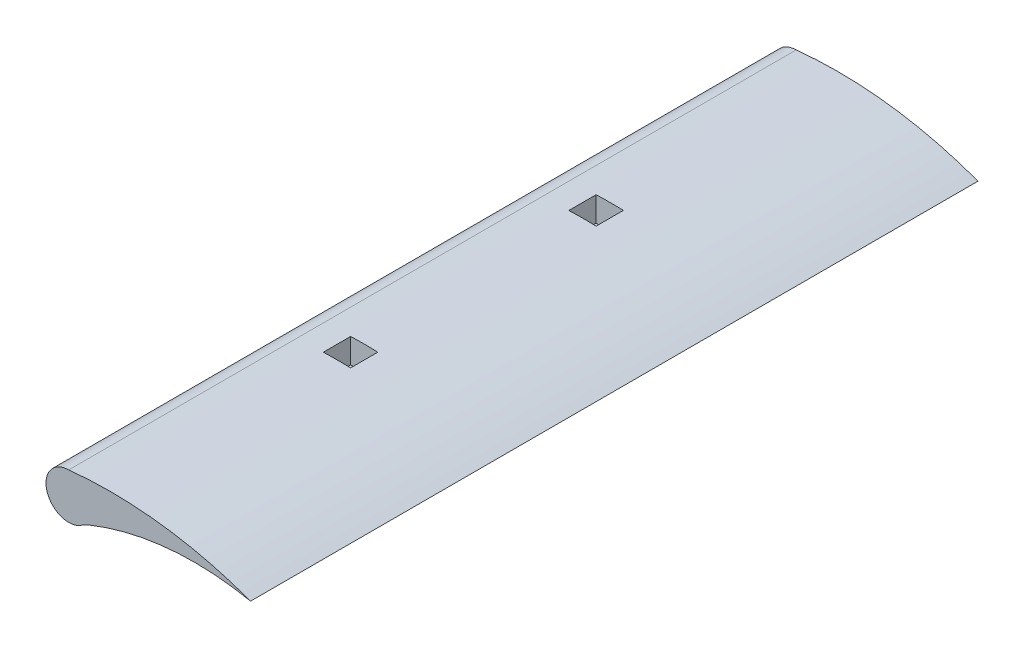
ISO-10303-21;
HEADER;
FILE_DESCRIPTION(('STEP AP214'),'2;1');
FILE_NAME('part.step','',(''),(''),'','','');
FILE_SCHEMA(('AUTOMOTIVE_DESIGN { 1 0 10303 214 1 1 1 1 }'));
ENDSEC;
DATA;
#1=APPLICATION_CONTEXT('core data for automotive mechanical design processes');
#2=APPLICATION_PROTOCOL_DEFINITION('international standard','automotive_design',2000,#1);
#3=PRODUCT_CONTEXT('',#1,'mechanical');
#4=PRODUCT('Part','Part','',(#3));
#5=PRODUCT_RELATED_PRODUCT_CATEGORY('part','',(#4));
#6=PRODUCT_DEFINITION_FORMATION('','',#4);
#7=PRODUCT_DEFINITION_CONTEXT('part definition',#1,'design');
#8=PRODUCT_DEFINITION('design','',#6,#7);
#9=PRODUCT_DEFINITION_SHAPE('','',#8);
#10=(LENGTH_UNIT() NAMED_UNIT(*) SI_UNIT(.MILLI.,.METRE.));
#11=(NAMED_UNIT(*) PLANE_ANGLE_UNIT() SI_UNIT($,.RADIAN.));
#12=(NAMED_UNIT(*) SI_UNIT($,.STERADIAN.) SOLID_ANGLE_UNIT());
#13=UNCERTAINTY_MEASURE_WITH_UNIT(LENGTH_MEASURE(1.E-05),#10,'distance_accuracy_value','');
#14=(GEOMETRIC_REPRESENTATION_CONTEXT(3) GLOBAL_UNCERTAINTY_ASSIGNED_CONTEXT((#13)) GLOBAL_UNIT_ASSIGNED_CONTEXT((#10,
#11,#12)) REPRESENTATION_CONTEXT('',''));
#15=CARTESIAN_POINT('',(0.,0.,0.));
#16=DIRECTION('',(0.,0.,1.));
#17=DIRECTION('',(1.,0.,0.));
#18=AXIS2_PLACEMENT_3D('',#15,#16,#17);
#19=CARTESIAN_POINT('',(4.60826121824582,-41.8839102540334,40.));
#20=DIRECTION('',(0.,0.,-1.));
#21=DIRECTION('',(-1.,0.,0.));
#22=AXIS2_PLACEMENT_3D('',#19,#20,#21);
#23=CYLINDRICAL_SURFACE('',#22,44.6225006122884);
#24=CARTESIAN_POINT('',(4.60826121824582,-41.8839102540334,-40.));
#25=DIRECTION('',(0.,0.,1.));
#26=DIRECTION('',(-1.,0.,0.));
#27=AXIS2_PLACEMENT_3D('',#24,#25,#26);
#28=CIRCLE('',#27,44.6225006122884);
#29=CARTESIAN_POINT('',(20.,0.,-40.));
#30=VERTEX_POINT('',#29);
#31=CARTESIAN_POINT('',(0.,2.5,-40.));
#32=VERTEX_POINT('',#31);
#33=EDGE_CURVE('E203',#30,#32,#28,.T.);
#34=ORIENTED_EDGE('',*,*,#33,.T.);
#35=DIRECTION('',(0.,0.,-1.));
#36=VECTOR('',#35,1.);
#37=CARTESIAN_POINT('',(0.,2.5,40.));
#38=LINE('',#37,#36);
#39=CARTESIAN_POINT('',(0.,2.5,40.));
#40=VERTEX_POINT('',#39);
#41=EDGE_CURVE('E210',#40,#32,#38,.T.);
#42=ORIENTED_EDGE('',*,*,#41,.F.);
#43=CARTESIAN_POINT('',(4.60826121824582,-41.8839102540334,40.));
#44=DIRECTION('',(0.,0.,1.));
#45=DIRECTION('',(-1.,0.,0.));
#46=AXIS2_PLACEMENT_3D('',#43,#44,#45);
#47=CIRCLE('',#46,44.6225006122884);
#48=CARTESIAN_POINT('',(20.,0.,40.));
#49=VERTEX_POINT('',#48);
#50=EDGE_CURVE('E89',#49,#40,#47,.T.);
#51=ORIENTED_EDGE('',*,*,#50,.F.);
#52=DIRECTION('',(0.,0.,-1.));
#53=VECTOR('',#52,1.);
#54=CARTESIAN_POINT('',(20.,0.,40.));
#55=LINE('',#54,#53);
#56=EDGE_CURVE('E212',#49,#30,#55,.T.);
#57=ORIENTED_EDGE('',*,*,#56,.T.);
#58=EDGE_LOOP('',(#34,#42,#51,#57));
#59=FACE_BOUND('',#58,.T.);
#60=CARTESIAN_POINT('',(4.60826121824582,-41.8839102540334,-15.));
#61=DIRECTION('',(0.,0.,1.));
#62=DIRECTION('',(1.,0.,0.));
#63=AXIS2_PLACEMENT_3D('',#60,#61,#62);
#64=CIRCLE('',#63,44.6225006122884);
#65=CARTESIAN_POINT('',(6.,2.71688148845745,-15.));
#66=VERTEX_POINT('',#65);
#67=CARTESIAN_POINT('',(3.,2.70959887843526,-15.));
#68=VERTEX_POINT('',#67);
#69=EDGE_CURVE('E214',#66,#68,#64,.T.);
#70=ORIENTED_EDGE('',*,*,#69,.F.);
#71=DIRECTION('',(0.,0.,-1.));
#72=VECTOR('',#71,1.);
#73=CARTESIAN_POINT('',(6.,2.71688148845745,40.));
#74=LINE('',#73,#72);
#75=CARTESIAN_POINT('',(6.,2.71688148845745,-12.));
#76=VERTEX_POINT('',#75);
#77=EDGE_CURVE('E221',#76,#66,#74,.T.);
#78=ORIENTED_EDGE('',*,*,#77,.F.);
#79=CARTESIAN_POINT('',(4.60826121824582,-41.8839102540334,-12.));
#80=DIRECTION('',(0.,0.,-1.));
#81=DIRECTION('',(-1.,0.,0.));
#82=AXIS2_PLACEMENT_3D('',#79,#80,#81);
#83=CIRCLE('',#82,44.6225006122884);
#84=CARTESIAN_POINT('',(3.,2.70959887843526,-12.));
#85=VERTEX_POINT('',#84);
#86=EDGE_CURVE('E216',#85,#76,#83,.T.);
#87=ORIENTED_EDGE('',*,*,#86,.F.);
#88=DIRECTION('',(0.,0.,-1.));
#89=VECTOR('',#88,1.);
#90=CARTESIAN_POINT('',(3.,2.70959887843526,40.));
#91=LINE('',#90,#89);
#92=EDGE_CURVE('E218',#68,#85,#91,.F.);
#93=ORIENTED_EDGE('',*,*,#92,.F.);
#94=EDGE_LOOP('',(#70,#78,#87,#93));
#95=FACE_BOUND('',#94,.T.);
#96=CARTESIAN_POINT('',(4.60826121824582,-41.8839102540334,15.));
#97=DIRECTION('',(0.,0.,-1.));
#98=DIRECTION('',(-1.,0.,0.));
#99=AXIS2_PLACEMENT_3D('',#96,#97,#98);
#100=CIRCLE('',#99,44.6225006122884);
#101=CARTESIAN_POINT('',(3.,2.70959887843526,15.));
#102=VERTEX_POINT('',#101);
#103=CARTESIAN_POINT('',(6.,2.71688148845745,15.));
#104=VERTEX_POINT('',#103);
#105=EDGE_CURVE('E224',#102,#104,#100,.T.);
#106=ORIENTED_EDGE('',*,*,#105,.F.);
#107=DIRECTION('',(0.,0.,-1.));
#108=VECTOR('',#107,1.);
#109=CARTESIAN_POINT('',(3.,2.70959887843526,40.));
#110=LINE('',#109,#108);
#111=CARTESIAN_POINT('',(3.,2.70959887843526,12.));
#112=VERTEX_POINT('',#111);
#113=EDGE_CURVE('E11',#112,#102,#110,.F.);
#114=ORIENTED_EDGE('',*,*,#113,.F.);
#115=CARTESIAN_POINT('',(4.60826121824582,-41.8839102540334,12.));
#116=DIRECTION('',(0.,0.,1.));
#117=DIRECTION('',(1.,0.,0.));
#118=AXIS2_PLACEMENT_3D('',#115,#116,#117);
#119=CIRCLE('',#118,44.6225006122884);
#120=CARTESIAN_POINT('',(6.,2.71688148845745,12.));
#121=VERTEX_POINT('',#120);
#122=EDGE_CURVE('E226',#121,#112,#119,.T.);
#123=ORIENTED_EDGE('',*,*,#122,.F.);
#124=DIRECTION('',(0.,0.,-1.));
#125=VECTOR('',#124,1.);
#126=CARTESIAN_POINT('',(6.,2.71688148845745,40.));
#127=LINE('',#126,#125);
#128=EDGE_CURVE('E49',#104,#121,#127,.T.);
#129=ORIENTED_EDGE('',*,*,#128,.F.);
#130=EDGE_LOOP('',(#106,#114,#123,#129));
#131=FACE_BOUND('',#130,.T.);
#132=ADVANCED_FACE('F40',(#59,#95,#131),#23,.T.);
#133=CARTESIAN_POINT('',(13.8252073481001,-30.3031623614519,40.));
#134=DIRECTION('',(0.,0.,-1.));
#135=DIRECTION('',(-1.,0.,0.));
#136=AXIS2_PLACEMENT_3D('',#133,#134,#135);
#137=CYLINDRICAL_SURFACE('',#136,30.9258744969075);
#138=CARTESIAN_POINT('',(13.8252073481001,-30.3031623614519,-40.));
#139=DIRECTION('',(0.,0.,-1.));
#140=DIRECTION('',(1.,0.,0.));
#141=AXIS2_PLACEMENT_3D('',#138,#139,#140);
#142=CIRCLE('',#141,30.9258744969075);
#143=CARTESIAN_POINT('',(2.22683424907984,-1.63458278634223,-40.));
#144=VERTEX_POINT('',#143);
#145=EDGE_CURVE('E149',#144,#30,#142,.T.);
#146=ORIENTED_EDGE('',*,*,#145,.T.);
#147=ORIENTED_EDGE('',*,*,#56,.F.);
#148=CARTESIAN_POINT('',(13.8252073481001,-30.3031623614519,40.));
#149=DIRECTION('',(0.,0.,-1.));
#150=DIRECTION('',(1.,0.,0.));
#151=AXIS2_PLACEMENT_3D('',#148,#149,#150);
#152=CIRCLE('',#151,30.9258744969075);
#153=CARTESIAN_POINT('',(2.22683424907984,-1.63458278634223,40.));
#154=VERTEX_POINT('',#153);
#155=EDGE_CURVE('E194',#154,#49,#152,.T.);
#156=ORIENTED_EDGE('',*,*,#155,.F.);
#157=DIRECTION('',(0.,0.,-1.));
#158=VECTOR('',#157,1.);
#159=CARTESIAN_POINT('',(2.22683424907984,-1.63458278634223,40.));
#160=LINE('',#159,#158);
#161=EDGE_CURVE('E200',#154,#144,#160,.T.);
#162=ORIENTED_EDGE('',*,*,#161,.T.);
#163=EDGE_LOOP('',(#146,#147,#156,#162));
#164=FACE_BOUND('',#163,.T.);
#165=ADVANCED_FACE('F42',(#164),#137,.F.);
#166=CARTESIAN_POINT('',(0.,0.,40.));
#167=DIRECTION('',(0.,0.,-1.));
#168=DIRECTION('',(-1.,0.,0.));
#169=AXIS2_PLACEMENT_3D('',#166,#167,#168);
#170=CYLINDRICAL_SURFACE('',#169,2.5);
#171=CARTESIAN_POINT('',(0.,0.,-40.));
#172=DIRECTION('',(0.,0.,1.));
#173=DIRECTION('',(1.,0.,0.));
#174=AXIS2_PLACEMENT_3D('',#171,#172,#173);
#175=CIRCLE('',#174,2.5);
#176=CARTESIAN_POINT('',(1.39058743412579,-2.07756265562593,-40.));
#177=VERTEX_POINT('',#176);
#178=EDGE_CURVE('E75',#32,#177,#175,.T.);
#179=ORIENTED_EDGE('',*,*,#178,.T.);
#180=DIRECTION('',(0.,0.,-1.));
#181=VECTOR('',#180,1.);
#182=CARTESIAN_POINT('',(1.39058743412579,-2.07756265562593,40.));
#183=LINE('',#182,#181);
#184=CARTESIAN_POINT('',(1.39058743412579,-2.07756265562593,40.));
#185=VERTEX_POINT('',#184);
#186=EDGE_CURVE('E208',#185,#177,#183,.T.);
#187=ORIENTED_EDGE('',*,*,#186,.F.);
#188=CARTESIAN_POINT('',(0.,0.,40.));
#189=DIRECTION('',(0.,0.,1.));
#190=DIRECTION('',(1.,0.,0.));
#191=AXIS2_PLACEMENT_3D('',#188,#189,#190);
#192=CIRCLE('',#191,2.5);
#193=EDGE_CURVE('E197',#40,#185,#192,.T.);
#194=ORIENTED_EDGE('',*,*,#193,.F.);
#195=ORIENTED_EDGE('',*,*,#41,.T.);
#196=EDGE_LOOP('',(#179,#187,#194,#195));
#197=FACE_BOUND('',#196,.T.);
#198=ADVANCED_FACE('F246',(#197),#170,.T.);
#199=CARTESIAN_POINT('',(3.95767947195082,-5.91284436496541,40.));
#200=DIRECTION('',(0.,0.,-1.));
#201=DIRECTION('',(-1.,0.,0.));
#202=AXIS2_PLACEMENT_3D('',#199,#200,#201);
#203=CYLINDRICAL_SURFACE('',#202,4.6151215932691);
#204=CARTESIAN_POINT('',(3.95767947195082,-5.91284436496541,-40.));
#205=DIRECTION('',(0.,0.,-1.));
#206=DIRECTION('',(1.,0.,0.));
#207=AXIS2_PLACEMENT_3D('',#204,#205,#206);
#208=CIRCLE('',#207,4.6151215932691);
#209=EDGE_CURVE('E81',#177,#144,#208,.T.);
#210=ORIENTED_EDGE('',*,*,#209,.T.);
#211=ORIENTED_EDGE('',*,*,#161,.F.);
#212=CARTESIAN_POINT('',(3.95767947195082,-5.91284436496541,40.));
#213=DIRECTION('',(0.,0.,-1.));
#214=DIRECTION('',(1.,0.,0.));
#215=AXIS2_PLACEMENT_3D('',#212,#213,#214);
#216=CIRCLE('',#215,4.6151215932691);
#217=EDGE_CURVE('E57',#185,#154,#216,.T.);
#218=ORIENTED_EDGE('',*,*,#217,.F.);
#219=ORIENTED_EDGE('',*,*,#186,.T.);
#220=EDGE_LOOP('',(#210,#211,#218,#219));
#221=FACE_BOUND('',#220,.T.);
#222=ADVANCED_FACE('F252',(#221),#203,.F.);
#223=CARTESIAN_POINT('',(8.89144341002545,-18.1080033632086,40.));
#224=DIRECTION('',(0.,0.,1.));
#225=DIRECTION('',(1.,0.,0.));
#226=AXIS2_PLACEMENT_3D('',#223,#224,#225);
#227=PLANE('',#226);
#228=ORIENTED_EDGE('',*,*,#155,.T.);
#229=ORIENTED_EDGE('',*,*,#50,.T.);
#230=ORIENTED_EDGE('',*,*,#193,.T.);
#231=ORIENTED_EDGE('',*,*,#217,.T.);
#232=EDGE_LOOP('',(#228,#229,#230,#231));
#233=FACE_BOUND('',#232,.T.);
#234=ADVANCED_FACE('F255',(#233),#227,.T.);
#235=CARTESIAN_POINT('',(8.89144341002545,-18.1080033632086,-40.));
#236=DIRECTION('',(0.,0.,1.));
#237=DIRECTION('',(1.,0.,0.));
#238=AXIS2_PLACEMENT_3D('',#235,#236,#237);
#239=PLANE('',#238);
#240=ORIENTED_EDGE('',*,*,#145,.F.);
#241=ORIENTED_EDGE('',*,*,#209,.F.);
#242=ORIENTED_EDGE('',*,*,#178,.F.);
#243=ORIENTED_EDGE('',*,*,#33,.F.);
#244=EDGE_LOOP('',(#240,#241,#242,#243));
#245=FACE_BOUND('',#244,.T.);
#246=ADVANCED_FACE('F256',(#245),#239,.F.);
#247=CARTESIAN_POINT('',(3.,2.73859035825501,-15.));
#248=DIRECTION('',(1.,0.,0.));
#249=DIRECTION('',(0.,0.,-1.));
#250=AXIS2_PLACEMENT_3D('',#247,#248,#249);
#251=PLANE('',#250);
#252=ORIENTED_EDGE('',*,*,#92,.T.);
#253=DIRECTION('',(0.,-1.,0.));
#254=VECTOR('',#253,1.);
#255=CARTESIAN_POINT('',(3.,2.73859035825501,-12.));
#256=LINE('',#255,#254);
#257=CARTESIAN_POINT('',(3.,0.,-12.));
#258=VERTEX_POINT('',#257);
#259=EDGE_CURVE('E178',#85,#258,#256,.T.);
#260=ORIENTED_EDGE('',*,*,#259,.T.);
#261=DIRECTION('',(0.,0.,1.));
#262=VECTOR('',#261,1.);
#263=CARTESIAN_POINT('',(3.,0.,-15.));
#264=LINE('',#263,#262);
#265=CARTESIAN_POINT('',(3.,0.,-15.));
#266=VERTEX_POINT('',#265);
#267=EDGE_CURVE('E165',#266,#258,#264,.T.);
#268=ORIENTED_EDGE('',*,*,#267,.F.);
#269=DIRECTION('',(0.,-1.,0.));
#270=VECTOR('',#269,1.);
#271=CARTESIAN_POINT('',(3.,2.73859035825501,-15.));
#272=LINE('',#271,#270);
#273=EDGE_CURVE('E184',#68,#266,#272,.T.);
#274=ORIENTED_EDGE('',*,*,#273,.F.);
#275=EDGE_LOOP('',(#252,#260,#268,#274));
#276=FACE_BOUND('',#275,.T.);
#277=ADVANCED_FACE('F259',(#276),#251,.T.);
#278=CARTESIAN_POINT('',(3.,2.73859035825501,-12.));
#279=DIRECTION('',(0.,0.,-1.));
#280=DIRECTION('',(-1.,0.,0.));
#281=AXIS2_PLACEMENT_3D('',#278,#279,#280);
#282=PLANE('',#281);
#283=ORIENTED_EDGE('',*,*,#259,.F.);
#284=ORIENTED_EDGE('',*,*,#86,.T.);
#285=DIRECTION('',(0.,-1.,0.));
#286=VECTOR('',#285,1.);
#287=CARTESIAN_POINT('',(6.,2.73859035825501,-12.));
#288=LINE('',#287,#286);
#289=CARTESIAN_POINT('',(6.,0.,-12.));
#290=VERTEX_POINT('',#289);
#291=EDGE_CURVE('E180',#76,#290,#288,.T.);
#292=ORIENTED_EDGE('',*,*,#291,.T.);
#293=DIRECTION('',(1.,0.,0.));
#294=VECTOR('',#293,1.);
#295=CARTESIAN_POINT('',(3.,0.,-12.));
#296=LINE('',#295,#294);
#297=EDGE_CURVE('E168',#258,#290,#296,.T.);
#298=ORIENTED_EDGE('',*,*,#297,.F.);
#299=EDGE_LOOP('',(#283,#284,#292,#298));
#300=FACE_BOUND('',#299,.T.);
#301=ADVANCED_FACE('F274',(#300),#282,.T.);
#302=CARTESIAN_POINT('',(6.,2.73859035825501,-15.));
#303=DIRECTION('',(-1.,0.,0.));
#304=DIRECTION('',(0.,0.,1.));
#305=AXIS2_PLACEMENT_3D('',#302,#303,#304);
#306=PLANE('',#305);
#307=ORIENTED_EDGE('',*,*,#77,.T.);
#308=DIRECTION('',(0.,-1.,0.));
#309=VECTOR('',#308,1.);
#310=CARTESIAN_POINT('',(6.,2.73859035825501,-15.));
#311=LINE('',#310,#309);
#312=CARTESIAN_POINT('',(6.,0.,-15.));
#313=VERTEX_POINT('',#312);
#314=EDGE_CURVE('E182',#66,#313,#311,.T.);
#315=ORIENTED_EDGE('',*,*,#314,.T.);
#316=DIRECTION('',(0.,0.,-1.));
#317=VECTOR('',#316,1.);
#318=CARTESIAN_POINT('',(6.,0.,-15.));
#319=LINE('',#318,#317);
#320=EDGE_CURVE('E189',#290,#313,#319,.T.);
#321=ORIENTED_EDGE('',*,*,#320,.F.);
#322=ORIENTED_EDGE('',*,*,#291,.F.);
#323=EDGE_LOOP('',(#307,#315,#321,#322));
#324=FACE_BOUND('',#323,.T.);
#325=ADVANCED_FACE('F270',(#324),#306,.T.);
#326=CARTESIAN_POINT('',(3.,2.73859035825501,-15.));
#327=DIRECTION('',(0.,0.,1.));
#328=DIRECTION('',(1.,0.,0.));
#329=AXIS2_PLACEMENT_3D('',#326,#327,#328);
#330=PLANE('',#329);
#331=ORIENTED_EDGE('',*,*,#314,.F.);
#332=ORIENTED_EDGE('',*,*,#69,.T.);
#333=ORIENTED_EDGE('',*,*,#273,.T.);
#334=DIRECTION('',(-1.,0.,0.));
#335=VECTOR('',#334,1.);
#336=CARTESIAN_POINT('',(3.,0.,-15.));
#337=LINE('',#336,#335);
#338=EDGE_CURVE('E186',#313,#266,#337,.T.);
#339=ORIENTED_EDGE('',*,*,#338,.F.);
#340=EDGE_LOOP('',(#331,#332,#333,#339));
#341=FACE_BOUND('',#340,.T.);
#342=ADVANCED_FACE('F266',(#341),#330,.T.);
#343=CARTESIAN_POINT('',(0.,0.,0.));
#344=DIRECTION('',(0.,1.,0.));
#345=DIRECTION('',(0.,0.,1.));
#346=AXIS2_PLACEMENT_3D('',#343,#344,#345);
#347=PLANE('',#346);
#348=ORIENTED_EDGE('',*,*,#267,.T.);
#349=ORIENTED_EDGE('',*,*,#297,.T.);
#350=ORIENTED_EDGE('',*,*,#320,.T.);
#351=ORIENTED_EDGE('',*,*,#338,.T.);
#352=EDGE_LOOP('',(#348,#349,#350,#351));
#353=FACE_BOUND('',#352,.T.);
#354=ADVANCED_FACE('F263',(#353),#347,.T.);
#355=CARTESIAN_POINT('',(6.,2.73859035825501,12.));
#356=DIRECTION('',(-1.,0.,0.));
#357=DIRECTION('',(0.,0.,1.));
#358=AXIS2_PLACEMENT_3D('',#355,#356,#357);
#359=PLANE('',#358);
#360=ORIENTED_EDGE('',*,*,#128,.T.);
#361=DIRECTION('',(0.,-1.,0.));
#362=VECTOR('',#361,1.);
#363=CARTESIAN_POINT('',(6.,2.73859035825501,12.));
#364=LINE('',#363,#362);
#365=CARTESIAN_POINT('',(6.,0.,12.));
#366=VERTEX_POINT('',#365);
#367=EDGE_CURVE('E141',#121,#366,#364,.T.);
#368=ORIENTED_EDGE('',*,*,#367,.T.);
#369=DIRECTION('',(0.,0.,-1.));
#370=VECTOR('',#369,1.);
#371=CARTESIAN_POINT('',(6.,0.,12.));
#372=LINE('',#371,#370);
#373=CARTESIAN_POINT('',(6.,0.,15.));
#374=VERTEX_POINT('',#373);
#375=EDGE_CURVE('E146',#374,#366,#372,.T.);
#376=ORIENTED_EDGE('',*,*,#375,.F.);
#377=DIRECTION('',(0.,-1.,0.));
#378=VECTOR('',#377,1.);
#379=CARTESIAN_POINT('',(6.,2.73859035825501,15.));
#380=LINE('',#379,#378);
#381=EDGE_CURVE('E173',#104,#374,#380,.T.);
#382=ORIENTED_EDGE('',*,*,#381,.F.);
#383=EDGE_LOOP('',(#360,#368,#376,#382));
#384=FACE_BOUND('',#383,.T.);
#385=ADVANCED_FACE('F143',(#384),#359,.T.);
#386=CARTESIAN_POINT('',(3.,2.73859035825501,12.));
#387=DIRECTION('',(0.,0.,1.));
#388=DIRECTION('',(1.,0.,0.));
#389=AXIS2_PLACEMENT_3D('',#386,#387,#388);
#390=PLANE('',#389);
#391=ORIENTED_EDGE('',*,*,#367,.F.);
#392=ORIENTED_EDGE('',*,*,#122,.T.);
#393=DIRECTION('',(0.,-1.,0.));
#394=VECTOR('',#393,1.);
#395=CARTESIAN_POINT('',(3.,2.73859035825501,12.));
#396=LINE('',#395,#394);
#397=CARTESIAN_POINT('',(3.,0.,12.));
#398=VERTEX_POINT('',#397);
#399=EDGE_CURVE('E150',#112,#398,#396,.T.);
#400=ORIENTED_EDGE('',*,*,#399,.T.);
#401=DIRECTION('',(-1.,0.,0.));
#402=VECTOR('',#401,1.);
#403=CARTESIAN_POINT('',(3.,0.,12.));
#404=LINE('',#403,#402);
#405=EDGE_CURVE('E153',#366,#398,#404,.T.);
#406=ORIENTED_EDGE('',*,*,#405,.F.);
#407=EDGE_LOOP('',(#391,#392,#400,#406));
#408=FACE_BOUND('',#407,.T.);
#409=ADVANCED_FACE('F154',(#408),#390,.T.);
#410=CARTESIAN_POINT('',(3.,2.73859035825501,15.));
#411=DIRECTION('',(1.,0.,0.));
#412=DIRECTION('',(0.,0.,-1.));
#413=AXIS2_PLACEMENT_3D('',#410,#411,#412);
#414=PLANE('',#413);
#415=ORIENTED_EDGE('',*,*,#113,.T.);
#416=DIRECTION('',(0.,-1.,0.));
#417=VECTOR('',#416,1.);
#418=CARTESIAN_POINT('',(3.,2.73859035825501,15.));
#419=LINE('',#418,#417);
#420=CARTESIAN_POINT('',(3.,0.,15.));
#421=VERTEX_POINT('',#420);
#422=EDGE_CURVE('E175',#102,#421,#419,.T.);
#423=ORIENTED_EDGE('',*,*,#422,.T.);
#424=DIRECTION('',(0.,0.,1.));
#425=VECTOR('',#424,1.);
#426=CARTESIAN_POINT('',(3.,0.,15.));
#427=LINE('',#426,#425);
#428=EDGE_CURVE('E159',#398,#421,#427,.T.);
#429=ORIENTED_EDGE('',*,*,#428,.F.);
#430=ORIENTED_EDGE('',*,*,#399,.F.);
#431=EDGE_LOOP('',(#415,#423,#429,#430));
#432=FACE_BOUND('',#431,.T.);
#433=ADVANCED_FACE('F230',(#432),#414,.T.);
#434=CARTESIAN_POINT('',(6.,2.73859035825501,15.));
#435=DIRECTION('',(0.,0.,-1.));
#436=DIRECTION('',(-1.,0.,0.));
#437=AXIS2_PLACEMENT_3D('',#434,#435,#436);
#438=PLANE('',#437);
#439=ORIENTED_EDGE('',*,*,#422,.F.);
#440=ORIENTED_EDGE('',*,*,#105,.T.);
#441=ORIENTED_EDGE('',*,*,#381,.T.);
#442=DIRECTION('',(1.,0.,0.));
#443=VECTOR('',#442,1.);
#444=CARTESIAN_POINT('',(6.,0.,15.));
#445=LINE('',#444,#443);
#446=EDGE_CURVE('E164',#421,#374,#445,.T.);
#447=ORIENTED_EDGE('',*,*,#446,.F.);
#448=EDGE_LOOP('',(#439,#440,#441,#447));
#449=FACE_BOUND('',#448,.T.);
#450=ADVANCED_FACE('F233',(#449),#438,.T.);
#451=CARTESIAN_POINT('',(0.,0.,0.));
#452=DIRECTION('',(0.,-1.,0.));
#453=DIRECTION('',(0.,0.,-1.));
#454=AXIS2_PLACEMENT_3D('',#451,#452,#453);
#455=PLANE('',#454);
#456=ORIENTED_EDGE('',*,*,#375,.T.);
#457=ORIENTED_EDGE('',*,*,#405,.T.);
#458=ORIENTED_EDGE('',*,*,#428,.T.);
#459=ORIENTED_EDGE('',*,*,#446,.T.);
#460=EDGE_LOOP('',(#456,#457,#458,#459));
#461=FACE_BOUND('',#460,.T.);
#462=ADVANCED_FACE('F162',(#461),#455,.F.);
#463=CLOSED_SHELL('',(#132,#165,#198,#222,#234,#246,#277,#301,#325,#342,#354,#385,#409,#433,
#450,#462));
#464=MANIFOLD_SOLID_BREP('B2',#463);
#465=ADVANCED_BREP_SHAPE_REPRESENTATION('',(#18,#464),#14);
#466=SHAPE_DEFINITION_REPRESENTATION(#9,#465);
ENDSEC;
END-ISO-10303-21;
